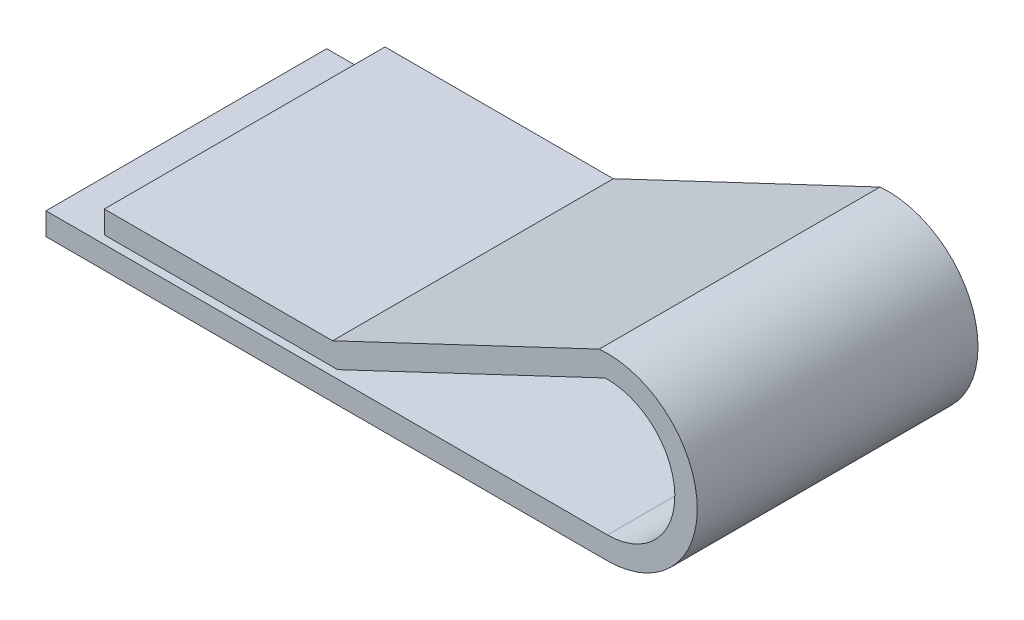
ISO-10303-21;
HEADER;
FILE_DESCRIPTION(('STEP AP214'),'2;1');
FILE_NAME('part.step','',(''),(''),'','','');
FILE_SCHEMA(('AUTOMOTIVE_DESIGN { 1 0 10303 214 1 1 1 1 }'));
ENDSEC;
DATA;
#1=APPLICATION_CONTEXT('core data for automotive mechanical design processes');
#2=APPLICATION_PROTOCOL_DEFINITION('international standard','automotive_design',2000,#1);
#3=PRODUCT_CONTEXT('',#1,'mechanical');
#4=PRODUCT('Part','Part','',(#3));
#5=PRODUCT_RELATED_PRODUCT_CATEGORY('part','',(#4));
#6=PRODUCT_DEFINITION_FORMATION('','',#4);
#7=PRODUCT_DEFINITION_CONTEXT('part definition',#1,'design');
#8=PRODUCT_DEFINITION('design','',#6,#7);
#9=PRODUCT_DEFINITION_SHAPE('','',#8);
#10=(LENGTH_UNIT() NAMED_UNIT(*) SI_UNIT(.MILLI.,.METRE.));
#11=(NAMED_UNIT(*) PLANE_ANGLE_UNIT() SI_UNIT($,.RADIAN.));
#12=(NAMED_UNIT(*) SI_UNIT($,.STERADIAN.) SOLID_ANGLE_UNIT());
#13=UNCERTAINTY_MEASURE_WITH_UNIT(LENGTH_MEASURE(1.E-05),#10,'distance_accuracy_value','');
#14=(GEOMETRIC_REPRESENTATION_CONTEXT(3) GLOBAL_UNCERTAINTY_ASSIGNED_CONTEXT((#13)) GLOBAL_UNIT_ASSIGNED_CONTEXT((#10,
#11,#12)) REPRESENTATION_CONTEXT('',''));
#15=CARTESIAN_POINT('',(0.,0.,0.));
#16=DIRECTION('',(0.,0.,1.));
#17=DIRECTION('',(1.,0.,0.));
#18=AXIS2_PLACEMENT_3D('',#15,#16,#17);
#19=CARTESIAN_POINT('',(-14.1076229331945,2.73385065311799,12.5));
#20=DIRECTION('',(0.,-1.,0.));
#21=DIRECTION('',(0.,0.,-1.));
#22=AXIS2_PLACEMENT_3D('',#19,#20,#21);
#23=PLANE('',#22);
#24=DIRECTION('',(1.,0.,0.));
#25=VECTOR('',#24,1.);
#26=CARTESIAN_POINT('',(-14.1076229331945,2.73385065311799,-12.5));
#27=LINE('',#26,#25);
#28=CARTESIAN_POINT('',(-14.5567439847743,2.73385065311799,-12.5));
#29=VERTEX_POINT('',#28);
#30=CARTESIAN_POINT('',(-34.8855825426186,2.73385065311799,-12.5));
#31=VERTEX_POINT('',#30);
#32=EDGE_CURVE('E157',#29,#31,#27,.F.);
#33=ORIENTED_EDGE('',*,*,#32,.T.);
#34=DIRECTION('',(0.,0.,-1.));
#35=VECTOR('',#34,1.);
#36=CARTESIAN_POINT('',(-34.8855825426186,2.73385065311799,12.5));
#37=LINE('',#36,#35);
#38=CARTESIAN_POINT('',(-34.8855825426186,2.73385065311799,12.5));
#39=VERTEX_POINT('',#38);
#40=EDGE_CURVE('E11',#39,#31,#37,.T.);
#41=ORIENTED_EDGE('',*,*,#40,.F.);
#42=DIRECTION('',(1.,0.,0.));
#43=VECTOR('',#42,1.);
#44=CARTESIAN_POINT('',(-14.1076229331945,2.73385065311799,12.5));
#45=LINE('',#44,#43);
#46=CARTESIAN_POINT('',(-14.5567439847743,2.73385065311799,12.5));
#47=VERTEX_POINT('',#46);
#48=EDGE_CURVE('E108',#47,#39,#45,.F.);
#49=ORIENTED_EDGE('',*,*,#48,.F.);
#50=DIRECTION('',(0.,0.,-1.));
#51=VECTOR('',#50,1.);
#52=CARTESIAN_POINT('',(-14.5567439847743,2.73385065311799,12.5));
#53=LINE('',#52,#51);
#54=EDGE_CURVE('E153',#47,#29,#53,.T.);
#55=ORIENTED_EDGE('',*,*,#54,.T.);
#56=EDGE_LOOP('',(#33,#41,#49,#55));
#57=FACE_BOUND('',#56,.T.);
#58=ADVANCED_FACE('F45',(#57),#23,.F.);
#59=CARTESIAN_POINT('',(-34.8855825426186,0.733850653117988,12.5));
#60=DIRECTION('',(-1.,0.,0.));
#61=DIRECTION('',(0.,0.,1.));
#62=AXIS2_PLACEMENT_3D('',#59,#60,#61);
#63=PLANE('',#62);
#64=DIRECTION('',(0.,1.,0.));
#65=VECTOR('',#64,1.);
#66=CARTESIAN_POINT('',(-34.8855825426186,0.733850653117988,-12.5));
#67=LINE('',#66,#65);
#68=CARTESIAN_POINT('',(-34.8855825426186,0.733850653117988,-12.5));
#69=VERTEX_POINT('',#68);
#70=EDGE_CURVE('E161',#69,#31,#67,.T.);
#71=ORIENTED_EDGE('',*,*,#70,.F.);
#72=DIRECTION('',(0.,0.,-1.));
#73=VECTOR('',#72,1.);
#74=CARTESIAN_POINT('',(-34.8855825426186,0.733850653117988,12.5));
#75=LINE('',#74,#73);
#76=CARTESIAN_POINT('',(-34.8855825426186,0.733850653117988,12.5));
#77=VERTEX_POINT('',#76);
#78=EDGE_CURVE('E54',#77,#69,#75,.T.);
#79=ORIENTED_EDGE('',*,*,#78,.F.);
#80=DIRECTION('',(0.,1.,0.));
#81=VECTOR('',#80,1.);
#82=CARTESIAN_POINT('',(-34.8855825426186,0.733850653117988,12.5));
#83=LINE('',#82,#81);
#84=EDGE_CURVE('E231',#77,#39,#83,.T.);
#85=ORIENTED_EDGE('',*,*,#84,.T.);
#86=ORIENTED_EDGE('',*,*,#40,.T.);
#87=EDGE_LOOP('',(#71,#79,#85,#86));
#88=FACE_BOUND('',#87,.T.);
#89=ADVANCED_FACE('F218',(#88),#63,.T.);
#90=CARTESIAN_POINT('',(-14.1076229331945,0.733850653117988,12.5));
#91=DIRECTION('',(0.,-1.,0.));
#92=DIRECTION('',(0.,0.,-1.));
#93=AXIS2_PLACEMENT_3D('',#90,#91,#92);
#94=PLANE('',#93);
#95=DIRECTION('',(-1.,0.,0.));
#96=VECTOR('',#95,1.);
#97=CARTESIAN_POINT('',(-14.1076229331945,0.733850653117988,-12.5));
#98=LINE('',#97,#96);
#99=CARTESIAN_POINT('',(-14.1076229331945,0.733850653117988,-12.5));
#100=VERTEX_POINT('',#99);
#101=EDGE_CURVE('E165',#100,#69,#98,.T.);
#102=ORIENTED_EDGE('',*,*,#101,.F.);
#103=DIRECTION('',(0.,0.,-1.));
#104=VECTOR('',#103,1.);
#105=CARTESIAN_POINT('',(-14.1076229331945,0.733850653117988,12.5));
#106=LINE('',#105,#104);
#107=CARTESIAN_POINT('',(-14.1076229331945,0.733850653117988,12.5));
#108=VERTEX_POINT('',#107);
#109=EDGE_CURVE('E206',#108,#100,#106,.T.);
#110=ORIENTED_EDGE('',*,*,#109,.F.);
#111=DIRECTION('',(-1.,0.,0.));
#112=VECTOR('',#111,1.);
#113=CARTESIAN_POINT('',(-14.1076229331945,0.733850653117988,12.5));
#114=LINE('',#113,#112);
#115=EDGE_CURVE('E215',#108,#77,#114,.T.);
#116=ORIENTED_EDGE('',*,*,#115,.T.);
#117=ORIENTED_EDGE('',*,*,#78,.T.);
#118=EDGE_LOOP('',(#102,#110,#116,#117));
#119=FACE_BOUND('',#118,.T.);
#120=ADVANCED_FACE('F213',(#119),#94,.T.);
#121=CARTESIAN_POINT('',(9.7038495218078,11.9960057359668,12.5));
#122=DIRECTION('',(0.427560285330362,-0.903986837519341,0.));
#123=DIRECTION('',(0.903986837519341,0.427560285330363,0.));
#124=AXIS2_PLACEMENT_3D('',#121,#122,#123);
#125=PLANE('',#124);
#126=DIRECTION('',(-0.903986837519341,-0.427560285330362,0.));
#127=VECTOR('',#126,1.);
#128=CARTESIAN_POINT('',(9.7038495218078,11.9960057359668,-12.5));
#129=LINE('',#128,#127);
#130=CARTESIAN_POINT('',(9.7038495218078,11.9960057359668,-12.5));
#131=VERTEX_POINT('',#130);
#132=EDGE_CURVE('E169',#131,#100,#129,.T.);
#133=ORIENTED_EDGE('',*,*,#132,.F.);
#134=DIRECTION('',(0.,0.,-1.));
#135=VECTOR('',#134,1.);
#136=CARTESIAN_POINT('',(9.7038495218078,11.9960057359668,12.5));
#137=LINE('',#136,#135);
#138=CARTESIAN_POINT('',(9.7038495218078,11.9960057359668,12.5));
#139=VERTEX_POINT('',#138);
#140=EDGE_CURVE('E203',#139,#131,#137,.T.);
#141=ORIENTED_EDGE('',*,*,#140,.F.);
#142=DIRECTION('',(-0.903986837519341,-0.427560285330362,0.));
#143=VECTOR('',#142,1.);
#144=CARTESIAN_POINT('',(9.7038495218078,11.9960057359668,12.5));
#145=LINE('',#144,#143);
#146=EDGE_CURVE('E228',#139,#108,#145,.T.);
#147=ORIENTED_EDGE('',*,*,#146,.T.);
#148=ORIENTED_EDGE('',*,*,#109,.T.);
#149=EDGE_LOOP('',(#133,#141,#147,#148));
#150=FACE_BOUND('',#149,.T.);
#151=ADVANCED_FACE('F225',(#150),#125,.T.);
#152=CARTESIAN_POINT('',(9.92274496317986,6.,12.5));
#153=DIRECTION('',(0.,0.,-1.));
#154=DIRECTION('',(-1.,0.,0.));
#155=AXIS2_PLACEMENT_3D('',#152,#153,#154);
#156=CYLINDRICAL_SURFACE('',#155,6.);
#157=CARTESIAN_POINT('',(9.92274496317986,6.,-12.5));
#158=DIRECTION('',(0.,0.,1.));
#159=DIRECTION('',(1.,0.,0.));
#160=AXIS2_PLACEMENT_3D('',#157,#158,#159);
#161=CIRCLE('',#160,6.);
#162=CARTESIAN_POINT('',(9.92274496317986,0.,-12.5));
#163=VERTEX_POINT('',#162);
#164=EDGE_CURVE('E173',#163,#131,#161,.T.);
#165=ORIENTED_EDGE('',*,*,#164,.F.);
#166=DIRECTION('',(0.,0.,-1.));
#167=VECTOR('',#166,1.);
#168=CARTESIAN_POINT('',(9.92274496317986,0.,12.5));
#169=LINE('',#168,#167);
#170=CARTESIAN_POINT('',(9.92274496317986,0.,12.5));
#171=VERTEX_POINT('',#170);
#172=EDGE_CURVE('E200',#171,#163,#169,.T.);
#173=ORIENTED_EDGE('',*,*,#172,.F.);
#174=CARTESIAN_POINT('',(9.92274496317986,6.,12.5));
#175=DIRECTION('',(0.,0.,1.));
#176=DIRECTION('',(1.,0.,0.));
#177=AXIS2_PLACEMENT_3D('',#174,#175,#176);
#178=CIRCLE('',#177,6.);
#179=EDGE_CURVE('E236',#171,#139,#178,.T.);
#180=ORIENTED_EDGE('',*,*,#179,.T.);
#181=ORIENTED_EDGE('',*,*,#140,.T.);
#182=EDGE_LOOP('',(#165,#173,#180,#181));
#183=FACE_BOUND('',#182,.T.);
#184=ADVANCED_FACE('F273',(#183),#156,.F.);
#185=CARTESIAN_POINT('',(-40.0772550368201,0.,12.5));
#186=DIRECTION('',(0.,1.,0.));
#187=DIRECTION('',(0.,0.,1.));
#188=AXIS2_PLACEMENT_3D('',#185,#186,#187);
#189=PLANE('',#188);
#190=DIRECTION('',(1.,0.,0.));
#191=VECTOR('',#190,1.);
#192=CARTESIAN_POINT('',(-40.0772550368201,0.,-12.5));
#193=LINE('',#192,#191);
#194=CARTESIAN_POINT('',(-40.0772550368201,0.,-12.5));
#195=VERTEX_POINT('',#194);
#196=EDGE_CURVE('E177',#195,#163,#193,.T.);
#197=ORIENTED_EDGE('',*,*,#196,.F.);
#198=DIRECTION('',(0.,0.,-1.));
#199=VECTOR('',#198,1.);
#200=CARTESIAN_POINT('',(-40.0772550368201,0.,12.5));
#201=LINE('',#200,#199);
#202=CARTESIAN_POINT('',(-40.0772550368201,0.,12.5));
#203=VERTEX_POINT('',#202);
#204=EDGE_CURVE('E197',#203,#195,#201,.T.);
#205=ORIENTED_EDGE('',*,*,#204,.F.);
#206=DIRECTION('',(1.,0.,0.));
#207=VECTOR('',#206,1.);
#208=CARTESIAN_POINT('',(-40.0772550368201,0.,12.5));
#209=LINE('',#208,#207);
#210=EDGE_CURVE('E243',#203,#171,#209,.T.);
#211=ORIENTED_EDGE('',*,*,#210,.T.);
#212=ORIENTED_EDGE('',*,*,#172,.T.);
#213=EDGE_LOOP('',(#197,#205,#211,#212));
#214=FACE_BOUND('',#213,.T.);
#215=ADVANCED_FACE('F276',(#214),#189,.T.);
#216=CARTESIAN_POINT('',(-40.0772550368201,-2.,12.5));
#217=DIRECTION('',(-1.,0.,0.));
#218=DIRECTION('',(0.,0.,1.));
#219=AXIS2_PLACEMENT_3D('',#216,#217,#218);
#220=PLANE('',#219);
#221=DIRECTION('',(0.,1.,0.));
#222=VECTOR('',#221,1.);
#223=CARTESIAN_POINT('',(-40.0772550368201,-2.,-12.5));
#224=LINE('',#223,#222);
#225=CARTESIAN_POINT('',(-40.0772550368201,-2.,-12.5));
#226=VERTEX_POINT('',#225);
#227=EDGE_CURVE('E181',#226,#195,#224,.T.);
#228=ORIENTED_EDGE('',*,*,#227,.F.);
#229=DIRECTION('',(0.,0.,-1.));
#230=VECTOR('',#229,1.);
#231=CARTESIAN_POINT('',(-40.0772550368201,-2.,12.5));
#232=LINE('',#231,#230);
#233=CARTESIAN_POINT('',(-40.0772550368201,-2.,12.5));
#234=VERTEX_POINT('',#233);
#235=EDGE_CURVE('E146',#234,#226,#232,.T.);
#236=ORIENTED_EDGE('',*,*,#235,.F.);
#237=DIRECTION('',(0.,1.,0.));
#238=VECTOR('',#237,1.);
#239=CARTESIAN_POINT('',(-40.0772550368201,-2.,12.5));
#240=LINE('',#239,#238);
#241=EDGE_CURVE('E137',#234,#203,#240,.T.);
#242=ORIENTED_EDGE('',*,*,#241,.T.);
#243=ORIENTED_EDGE('',*,*,#204,.T.);
#244=EDGE_LOOP('',(#228,#236,#242,#243));
#245=FACE_BOUND('',#244,.T.);
#246=ADVANCED_FACE('F249',(#245),#220,.T.);
#247=CARTESIAN_POINT('',(-40.0772550368201,-2.,12.5));
#248=DIRECTION('',(0.,1.,0.));
#249=DIRECTION('',(0.,0.,1.));
#250=AXIS2_PLACEMENT_3D('',#247,#248,#249);
#251=PLANE('',#250);
#252=DIRECTION('',(1.,0.,0.));
#253=VECTOR('',#252,1.);
#254=CARTESIAN_POINT('',(-40.0772550368201,-2.,-12.5));
#255=LINE('',#254,#253);
#256=CARTESIAN_POINT('',(9.92274496317986,-2.,-12.5));
#257=VERTEX_POINT('',#256);
#258=EDGE_CURVE('E144',#226,#257,#255,.T.);
#259=ORIENTED_EDGE('',*,*,#258,.T.);
#260=DIRECTION('',(0.,0.,-1.));
#261=VECTOR('',#260,1.);
#262=CARTESIAN_POINT('',(9.92274496317986,-2.,12.5));
#263=LINE('',#262,#261);
#264=CARTESIAN_POINT('',(9.92274496317986,-2.,12.5));
#265=VERTEX_POINT('',#264);
#266=EDGE_CURVE('E141',#265,#257,#263,.T.);
#267=ORIENTED_EDGE('',*,*,#266,.F.);
#268=DIRECTION('',(1.,0.,0.));
#269=VECTOR('',#268,1.);
#270=CARTESIAN_POINT('',(-40.0772550368201,-2.,12.5));
#271=LINE('',#270,#269);
#272=EDGE_CURVE('E130',#234,#265,#271,.T.);
#273=ORIENTED_EDGE('',*,*,#272,.F.);
#274=ORIENTED_EDGE('',*,*,#235,.T.);
#275=EDGE_LOOP('',(#259,#267,#273,#274));
#276=FACE_BOUND('',#275,.T.);
#277=ADVANCED_FACE('F142',(#276),#251,.F.);
#278=CARTESIAN_POINT('',(9.92274496317986,6.,12.5));
#279=DIRECTION('',(0.,0.,-1.));
#280=DIRECTION('',(-1.,0.,0.));
#281=AXIS2_PLACEMENT_3D('',#278,#279,#280);
#282=CYLINDRICAL_SURFACE('',#281,8.);
#283=CARTESIAN_POINT('',(9.92274496317986,6.,-12.5));
#284=DIRECTION('',(0.,0.,1.));
#285=DIRECTION('',(1.,0.,0.));
#286=AXIS2_PLACEMENT_3D('',#283,#284,#285);
#287=CIRCLE('',#286,8.);
#288=CARTESIAN_POINT('',(9.19257409583867,13.9666084693856,-12.5));
#289=VERTEX_POINT('',#288);
#290=EDGE_CURVE('E96',#257,#289,#287,.T.);
#291=ORIENTED_EDGE('',*,*,#290,.T.);
#292=DIRECTION('',(0.,0.,-1.));
#293=VECTOR('',#292,1.);
#294=CARTESIAN_POINT('',(9.19257409583867,13.9666084693856,12.5));
#295=LINE('',#294,#293);
#296=CARTESIAN_POINT('',(9.19257409583867,13.9666084693856,12.5));
#297=VERTEX_POINT('',#296);
#298=EDGE_CURVE('E147',#297,#289,#295,.T.);
#299=ORIENTED_EDGE('',*,*,#298,.F.);
#300=CARTESIAN_POINT('',(9.92274496317986,6.,12.5));
#301=DIRECTION('',(0.,0.,1.));
#302=DIRECTION('',(1.,0.,0.));
#303=AXIS2_PLACEMENT_3D('',#300,#301,#302);
#304=CIRCLE('',#303,8.);
#305=EDGE_CURVE('E134',#265,#297,#304,.T.);
#306=ORIENTED_EDGE('',*,*,#305,.F.);
#307=ORIENTED_EDGE('',*,*,#266,.T.);
#308=EDGE_LOOP('',(#291,#299,#306,#307));
#309=FACE_BOUND('',#308,.T.);
#310=ADVANCED_FACE('F149',(#309),#282,.T.);
#311=CARTESIAN_POINT('',(8.84872895114708,13.8039794110055,12.5));
#312=DIRECTION('',(0.427560285330362,-0.903986837519341,0.));
#313=DIRECTION('',(0.903986837519341,0.427560285330363,0.));
#314=AXIS2_PLACEMENT_3D('',#311,#312,#313);
#315=PLANE('',#314);
#316=DIRECTION('',(-0.903986837519341,-0.427560285330363,0.));
#317=VECTOR('',#316,1.);
#318=CARTESIAN_POINT('',(8.84872895114708,13.8039794110055,-12.5));
#319=LINE('',#318,#317);
#320=EDGE_CURVE('E102',#289,#29,#319,.T.);
#321=ORIENTED_EDGE('',*,*,#320,.T.);
#322=ORIENTED_EDGE('',*,*,#54,.F.);
#323=DIRECTION('',(-0.903986837519341,-0.427560285330363,0.));
#324=VECTOR('',#323,1.);
#325=CARTESIAN_POINT('',(8.84872895114708,13.8039794110055,12.5));
#326=LINE('',#325,#324);
#327=EDGE_CURVE('E62',#297,#47,#326,.T.);
#328=ORIENTED_EDGE('',*,*,#327,.F.);
#329=ORIENTED_EDGE('',*,*,#298,.T.);
#330=EDGE_LOOP('',(#321,#322,#328,#329));
#331=FACE_BOUND('',#330,.T.);
#332=ADVANCED_FACE('F252',(#331),#315,.F.);
#333=CARTESIAN_POINT('',(9.92274496317986,6.,12.5));
#334=DIRECTION('',(0.,0.,1.));
#335=DIRECTION('',(1.,0.,0.));
#336=AXIS2_PLACEMENT_3D('',#333,#334,#335);
#337=PLANE('',#336);
#338=ORIENTED_EDGE('',*,*,#48,.T.);
#339=ORIENTED_EDGE('',*,*,#84,.F.);
#340=ORIENTED_EDGE('',*,*,#115,.F.);
#341=ORIENTED_EDGE('',*,*,#146,.F.);
#342=ORIENTED_EDGE('',*,*,#179,.F.);
#343=ORIENTED_EDGE('',*,*,#210,.F.);
#344=ORIENTED_EDGE('',*,*,#241,.F.);
#345=ORIENTED_EDGE('',*,*,#272,.T.);
#346=ORIENTED_EDGE('',*,*,#305,.T.);
#347=ORIENTED_EDGE('',*,*,#327,.T.);
#348=EDGE_LOOP('',(#338,#339,#340,#341,#342,#343,#344,#345,#346,#347));
#349=FACE_BOUND('',#348,.T.);
#350=ADVANCED_FACE('F132',(#349),#337,.T.);
#351=CARTESIAN_POINT('',(9.92274496317986,6.,-12.5));
#352=DIRECTION('',(0.,0.,1.));
#353=DIRECTION('',(1.,0.,0.));
#354=AXIS2_PLACEMENT_3D('',#351,#352,#353);
#355=PLANE('',#354);
#356=ORIENTED_EDGE('',*,*,#32,.F.);
#357=ORIENTED_EDGE('',*,*,#320,.F.);
#358=ORIENTED_EDGE('',*,*,#290,.F.);
#359=ORIENTED_EDGE('',*,*,#258,.F.);
#360=ORIENTED_EDGE('',*,*,#227,.T.);
#361=ORIENTED_EDGE('',*,*,#196,.T.);
#362=ORIENTED_EDGE('',*,*,#164,.T.);
#363=ORIENTED_EDGE('',*,*,#132,.T.);
#364=ORIENTED_EDGE('',*,*,#101,.T.);
#365=ORIENTED_EDGE('',*,*,#70,.T.);
#366=EDGE_LOOP('',(#356,#357,#358,#359,#360,#361,#362,#363,#364,#365));
#367=FACE_BOUND('',#366,.T.);
#368=ADVANCED_FACE('F221',(#367),#355,.F.);
#369=CLOSED_SHELL('',(#58,#89,#120,#151,#184,#215,#246,#277,#310,#332,#350,#368));
#370=MANIFOLD_SOLID_BREP('B2',#369);
#371=ADVANCED_BREP_SHAPE_REPRESENTATION('',(#18,#370),#14);
#372=SHAPE_DEFINITION_REPRESENTATION(#9,#371);
ENDSEC;
END-ISO-10303-21;
